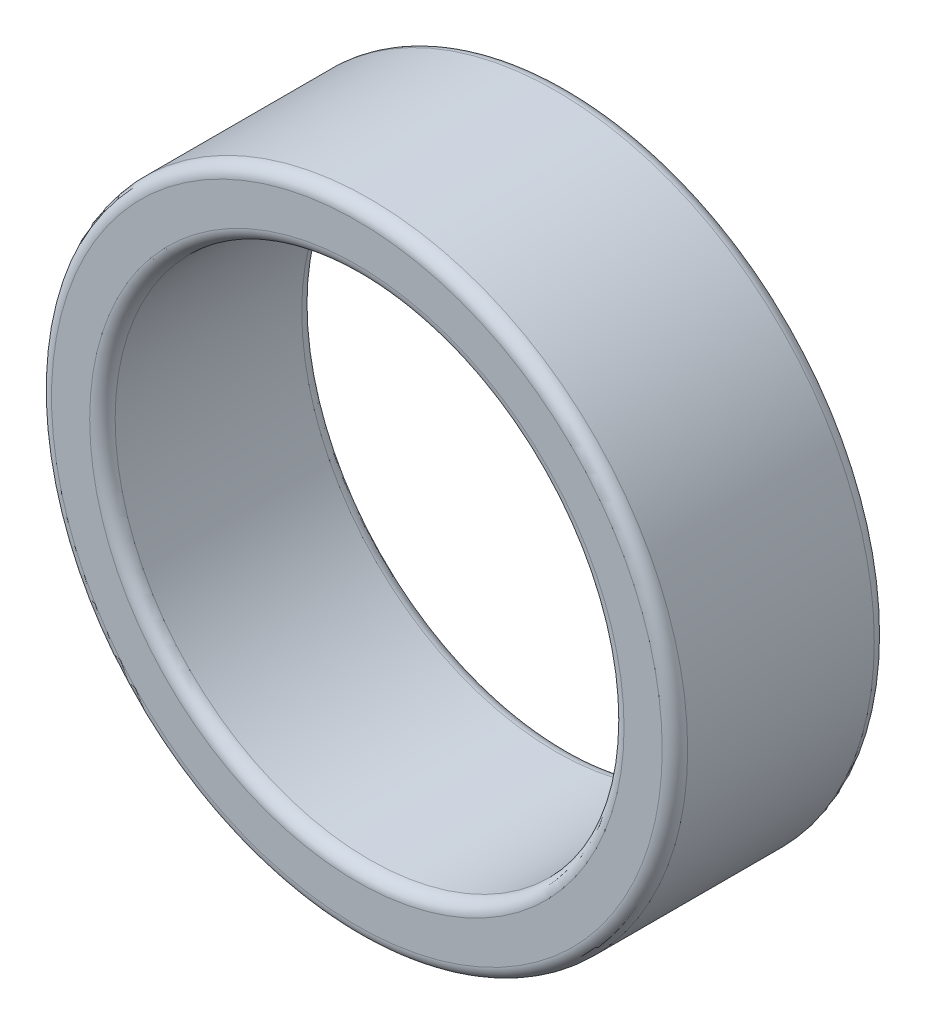
ISO-10303-21;
HEADER;
FILE_DESCRIPTION(('STEP AP214'),'2;1');
FILE_NAME('part.step','',(''),(''),'','','');
FILE_SCHEMA(('AUTOMOTIVE_DESIGN { 1 0 10303 214 1 1 1 1 }'));
ENDSEC;
DATA;
#1=APPLICATION_CONTEXT('core data for automotive mechanical design processes');
#2=APPLICATION_PROTOCOL_DEFINITION('international standard','automotive_design',2000,#1);
#3=PRODUCT_CONTEXT('',#1,'mechanical');
#4=PRODUCT('Part','Part','',(#3));
#5=PRODUCT_RELATED_PRODUCT_CATEGORY('part','',(#4));
#6=PRODUCT_DEFINITION_FORMATION('','',#4);
#7=PRODUCT_DEFINITION_CONTEXT('part definition',#1,'design');
#8=PRODUCT_DEFINITION('design','',#6,#7);
#9=PRODUCT_DEFINITION_SHAPE('','',#8);
#10=(LENGTH_UNIT() NAMED_UNIT(*) SI_UNIT(.MILLI.,.METRE.));
#11=(NAMED_UNIT(*) PLANE_ANGLE_UNIT() SI_UNIT($,.RADIAN.));
#12=(NAMED_UNIT(*) SI_UNIT($,.STERADIAN.) SOLID_ANGLE_UNIT());
#13=UNCERTAINTY_MEASURE_WITH_UNIT(LENGTH_MEASURE(1.E-05),#10,'distance_accuracy_value','');
#14=(GEOMETRIC_REPRESENTATION_CONTEXT(3) GLOBAL_UNCERTAINTY_ASSIGNED_CONTEXT((#13)) GLOBAL_UNIT_ASSIGNED_CONTEXT((#10,
#11,#12)) REPRESENTATION_CONTEXT('',''));
#15=CARTESIAN_POINT('',(0.,0.,0.));
#16=DIRECTION('',(0.,0.,1.));
#17=DIRECTION('',(1.,0.,0.));
#18=AXIS2_PLACEMENT_3D('',#15,#16,#17);
#19=CARTESIAN_POINT('',(0.,0.,-5.));
#20=DIRECTION('',(0.,0.,1.));
#21=DIRECTION('',(1.,0.,0.));
#22=AXIS2_PLACEMENT_3D('',#19,#20,#21);
#23=CYLINDRICAL_SURFACE('',#22,7.5);
#24=CARTESIAN_POINT('',(0.,0.,-0.3));
#25=DIRECTION('',(0.,0.,1.));
#26=DIRECTION('',(1.,0.,0.));
#27=AXIS2_PLACEMENT_3D('',#24,#25,#26);
#28=CIRCLE('',#27,7.5);
#29=CARTESIAN_POINT('',(7.5,0.,-0.3));
#30=VERTEX_POINT('',#29);
#31=EDGE_CURVE('E10',#30,#30,#28,.F.);
#32=ORIENTED_EDGE('',*,*,#31,.T.);
#33=EDGE_LOOP('',(#32));
#34=FACE_BOUND('',#33,.T.);
#35=CARTESIAN_POINT('',(0.,0.,-4.7));
#36=DIRECTION('',(0.,0.,1.));
#37=DIRECTION('',(1.,0.,0.));
#38=AXIS2_PLACEMENT_3D('',#35,#36,#37);
#39=CIRCLE('',#38,7.5);
#40=CARTESIAN_POINT('',(7.5,0.,-4.7));
#41=VERTEX_POINT('',#40);
#42=EDGE_CURVE('E43',#41,#41,#39,.T.);
#43=ORIENTED_EDGE('',*,*,#42,.T.);
#44=EDGE_LOOP('',(#43));
#45=FACE_BOUND('',#44,.T.);
#46=ADVANCED_FACE('F35',(#34,#45),#23,.T.);
#47=CARTESIAN_POINT('',(0.,0.,-5.));
#48=DIRECTION('',(0.,0.,1.));
#49=DIRECTION('',(1.,0.,0.));
#50=AXIS2_PLACEMENT_3D('',#47,#48,#49);
#51=PLANE('',#50);
#52=CARTESIAN_POINT('',(0.,0.,-5.));
#53=DIRECTION('',(0.,0.,1.));
#54=DIRECTION('',(1.,0.,0.));
#55=AXIS2_PLACEMENT_3D('',#52,#53,#54);
#56=CIRCLE('',#55,6.3);
#57=CARTESIAN_POINT('',(6.3,0.,-5.));
#58=VERTEX_POINT('',#57);
#59=EDGE_CURVE('E50',#58,#58,#56,.T.);
#60=ORIENTED_EDGE('',*,*,#59,.T.);
#61=EDGE_LOOP('',(#60));
#62=FACE_BOUND('',#61,.T.);
#63=CARTESIAN_POINT('',(0.,0.,-5.));
#64=DIRECTION('',(0.,0.,1.));
#65=DIRECTION('',(1.,0.,0.));
#66=AXIS2_PLACEMENT_3D('',#63,#64,#65);
#67=CIRCLE('',#66,7.2);
#68=CARTESIAN_POINT('',(7.2,0.,-5.));
#69=VERTEX_POINT('',#68);
#70=EDGE_CURVE('E56',#69,#69,#67,.F.);
#71=ORIENTED_EDGE('',*,*,#70,.T.);
#72=EDGE_LOOP('',(#71));
#73=FACE_BOUND('',#72,.T.);
#74=ADVANCED_FACE('F86',(#62,#73),#51,.F.);
#75=CARTESIAN_POINT('',(0.,0.,0.));
#76=DIRECTION('',(0.,0.,1.));
#77=DIRECTION('',(1.,0.,0.));
#78=AXIS2_PLACEMENT_3D('',#75,#76,#77);
#79=PLANE('',#78);
#80=CARTESIAN_POINT('',(0.,0.,0.));
#81=DIRECTION('',(0.,0.,1.));
#82=DIRECTION('',(1.,0.,0.));
#83=AXIS2_PLACEMENT_3D('',#80,#81,#82);
#84=CIRCLE('',#83,6.3);
#85=CARTESIAN_POINT('',(6.3,0.,0.));
#86=VERTEX_POINT('',#85);
#87=EDGE_CURVE('E61',#86,#86,#84,.F.);
#88=ORIENTED_EDGE('',*,*,#87,.T.);
#89=EDGE_LOOP('',(#88));
#90=FACE_BOUND('',#89,.T.);
#91=CARTESIAN_POINT('',(0.,0.,0.));
#92=DIRECTION('',(0.,0.,1.));
#93=DIRECTION('',(1.,0.,0.));
#94=AXIS2_PLACEMENT_3D('',#91,#92,#93);
#95=CIRCLE('',#94,7.2);
#96=CARTESIAN_POINT('',(7.2,0.,0.));
#97=VERTEX_POINT('',#96);
#98=EDGE_CURVE('E65',#97,#97,#95,.T.);
#99=ORIENTED_EDGE('',*,*,#98,.T.);
#100=EDGE_LOOP('',(#99));
#101=FACE_BOUND('',#100,.T.);
#102=ADVANCED_FACE('F89',(#90,#101),#79,.T.);
#103=CARTESIAN_POINT('',(0.,0.,-5.));
#104=DIRECTION('',(0.,0.,1.));
#105=DIRECTION('',(1.,0.,0.));
#106=AXIS2_PLACEMENT_3D('',#103,#104,#105);
#107=CYLINDRICAL_SURFACE('',#106,6.);
#108=CARTESIAN_POINT('',(0.,0.,-0.3));
#109=DIRECTION('',(0.,0.,1.));
#110=DIRECTION('',(1.,0.,0.));
#111=AXIS2_PLACEMENT_3D('',#108,#109,#110);
#112=CIRCLE('',#111,6.);
#113=CARTESIAN_POINT('',(6.,0.,-0.3));
#114=VERTEX_POINT('',#113);
#115=EDGE_CURVE('E68',#114,#114,#112,.T.);
#116=ORIENTED_EDGE('',*,*,#115,.T.);
#117=EDGE_LOOP('',(#116));
#118=FACE_BOUND('',#117,.T.);
#119=CARTESIAN_POINT('',(0.,0.,-4.7));
#120=DIRECTION('',(0.,0.,1.));
#121=DIRECTION('',(1.,0.,0.));
#122=AXIS2_PLACEMENT_3D('',#119,#120,#121);
#123=CIRCLE('',#122,6.);
#124=CARTESIAN_POINT('',(6.,0.,-4.7));
#125=VERTEX_POINT('',#124);
#126=EDGE_CURVE('E71',#125,#125,#123,.F.);
#127=ORIENTED_EDGE('',*,*,#126,.T.);
#128=EDGE_LOOP('',(#127));
#129=FACE_BOUND('',#128,.T.);
#130=ADVANCED_FACE('F76',(#118,#129),#107,.F.);
#131=CARTESIAN_POINT('',(0.,0.,-0.3));
#132=DIRECTION('',(0.,0.,1.));
#133=DIRECTION('',(1.,0.,0.));
#134=AXIS2_PLACEMENT_3D('',#131,#132,#133);
#135=TOROIDAL_SURFACE('',#134,6.3,0.3);
#136=ORIENTED_EDGE('',*,*,#87,.F.);
#137=EDGE_LOOP('',(#136));
#138=FACE_BOUND('',#137,.T.);
#139=ORIENTED_EDGE('',*,*,#115,.F.);
#140=EDGE_LOOP('',(#139));
#141=FACE_BOUND('',#140,.T.);
#142=ADVANCED_FACE('F82',(#138,#141),#135,.T.);
#143=CARTESIAN_POINT('',(0.,0.,-4.7));
#144=DIRECTION('',(0.,0.,1.));
#145=DIRECTION('',(1.,0.,0.));
#146=AXIS2_PLACEMENT_3D('',#143,#144,#145);
#147=TOROIDAL_SURFACE('',#146,6.3,0.3);
#148=ORIENTED_EDGE('',*,*,#126,.F.);
#149=EDGE_LOOP('',(#148));
#150=FACE_BOUND('',#149,.T.);
#151=ORIENTED_EDGE('',*,*,#59,.F.);
#152=EDGE_LOOP('',(#151));
#153=FACE_BOUND('',#152,.T.);
#154=ADVANCED_FACE('F78',(#150,#153),#147,.T.);
#155=CARTESIAN_POINT('',(0.,0.,-0.3));
#156=DIRECTION('',(0.,0.,1.));
#157=DIRECTION('',(1.,0.,0.));
#158=AXIS2_PLACEMENT_3D('',#155,#156,#157);
#159=TOROIDAL_SURFACE('',#158,7.2,0.3);
#160=ORIENTED_EDGE('',*,*,#31,.F.);
#161=EDGE_LOOP('',(#160));
#162=FACE_BOUND('',#161,.T.);
#163=ORIENTED_EDGE('',*,*,#98,.F.);
#164=EDGE_LOOP('',(#163));
#165=FACE_BOUND('',#164,.T.);
#166=ADVANCED_FACE('F81',(#162,#165),#159,.T.);
#167=CARTESIAN_POINT('',(0.,0.,-4.7));
#168=DIRECTION('',(0.,0.,1.));
#169=DIRECTION('',(1.,0.,0.));
#170=AXIS2_PLACEMENT_3D('',#167,#168,#169);
#171=TOROIDAL_SURFACE('',#170,7.2,0.3);
#172=ORIENTED_EDGE('',*,*,#70,.F.);
#173=EDGE_LOOP('',(#172));
#174=FACE_BOUND('',#173,.T.);
#175=ORIENTED_EDGE('',*,*,#42,.F.);
#176=EDGE_LOOP('',(#175));
#177=FACE_BOUND('',#176,.T.);
#178=ADVANCED_FACE('F37',(#174,#177),#171,.T.);
#179=CLOSED_SHELL('',(#46,#74,#102,#130,#142,#154,#166,#178));
#180=MANIFOLD_SOLID_BREP('B2',#179);
#181=ADVANCED_BREP_SHAPE_REPRESENTATION('',(#18,#180),#14);
#182=SHAPE_DEFINITION_REPRESENTATION(#9,#181);
ENDSEC;
END-ISO-10303-21;
